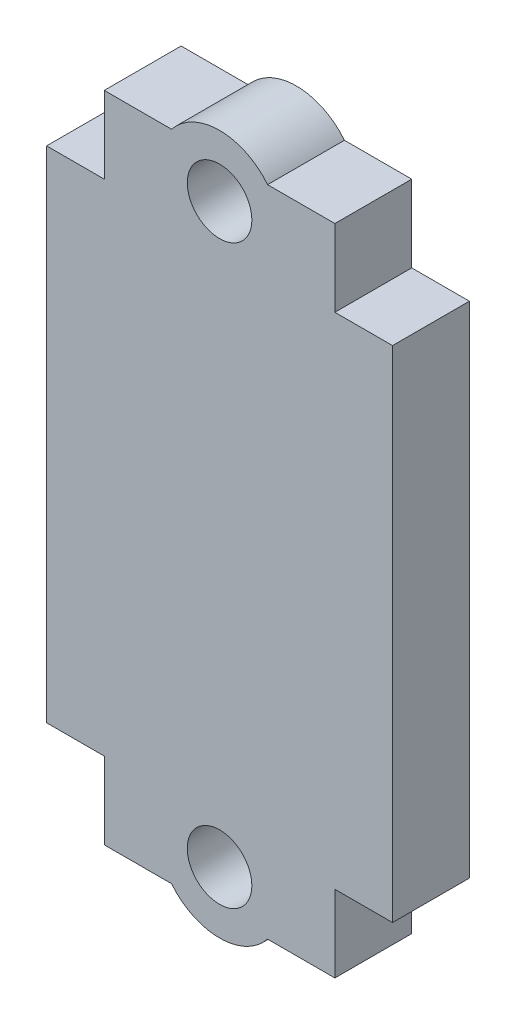
ISO-10303-21;
HEADER;
FILE_DESCRIPTION(('STEP AP214'),'2;1');
FILE_NAME('part.step','',(''),(''),'','','');
FILE_SCHEMA(('AUTOMOTIVE_DESIGN { 1 0 10303 214 1 1 1 1 }'));
ENDSEC;
DATA;
#1=APPLICATION_CONTEXT('core data for automotive mechanical design processes');
#2=APPLICATION_PROTOCOL_DEFINITION('international standard','automotive_design',2000,#1);
#3=PRODUCT_CONTEXT('',#1,'mechanical');
#4=PRODUCT('Part','Part','',(#3));
#5=PRODUCT_RELATED_PRODUCT_CATEGORY('part','',(#4));
#6=PRODUCT_DEFINITION_FORMATION('','',#4);
#7=PRODUCT_DEFINITION_CONTEXT('part definition',#1,'design');
#8=PRODUCT_DEFINITION('design','',#6,#7);
#9=PRODUCT_DEFINITION_SHAPE('','',#8);
#10=(LENGTH_UNIT() NAMED_UNIT(*) SI_UNIT(.MILLI.,.METRE.));
#11=(NAMED_UNIT(*) PLANE_ANGLE_UNIT() SI_UNIT($,.RADIAN.));
#12=(NAMED_UNIT(*) SI_UNIT($,.STERADIAN.) SOLID_ANGLE_UNIT());
#13=UNCERTAINTY_MEASURE_WITH_UNIT(LENGTH_MEASURE(1.E-05),#10,'distance_accuracy_value','');
#14=(GEOMETRIC_REPRESENTATION_CONTEXT(3) GLOBAL_UNCERTAINTY_ASSIGNED_CONTEXT((#13)) GLOBAL_UNIT_ASSIGNED_CONTEXT((#10,
#11,#12)) REPRESENTATION_CONTEXT('',''));
#15=CARTESIAN_POINT('',(0.,0.,0.));
#16=DIRECTION('',(0.,0.,1.));
#17=DIRECTION('',(1.,0.,0.));
#18=AXIS2_PLACEMENT_3D('',#15,#16,#17);
#19=CARTESIAN_POINT('',(-11.25,-2.5,5.));
#20=DIRECTION('',(0.,0.,-1.));
#21=DIRECTION('',(-1.,0.,0.));
#22=AXIS2_PLACEMENT_3D('',#19,#20,#21);
#23=CYLINDRICAL_SURFACE('',#22,2.1);
#24=CARTESIAN_POINT('',(-11.25,-2.5,5.));
#25=DIRECTION('',(0.,0.,1.));
#26=DIRECTION('',(1.,0.,0.));
#27=AXIS2_PLACEMENT_3D('',#24,#25,#26);
#28=CIRCLE('',#27,2.1);
#29=CARTESIAN_POINT('',(-9.15,-2.5,5.));
#30=VERTEX_POINT('',#29);
#31=EDGE_CURVE('E254',#30,#30,#28,.T.);
#32=ORIENTED_EDGE('',*,*,#31,.T.);
#33=EDGE_LOOP('',(#32));
#34=FACE_BOUND('',#33,.T.);
#35=CARTESIAN_POINT('',(-11.25,-2.5,0.));
#36=DIRECTION('',(0.,0.,1.));
#37=DIRECTION('',(1.,0.,0.));
#38=AXIS2_PLACEMENT_3D('',#35,#36,#37);
#39=CIRCLE('',#38,2.1);
#40=CARTESIAN_POINT('',(-9.15,-2.5,0.));
#41=VERTEX_POINT('',#40);
#42=EDGE_CURVE('E226',#41,#41,#39,.T.);
#43=ORIENTED_EDGE('',*,*,#42,.F.);
#44=EDGE_LOOP('',(#43));
#45=FACE_BOUND('',#44,.T.);
#46=ADVANCED_FACE('F85',(#34,#45),#23,.F.);
#47=CARTESIAN_POINT('',(0.,32.5,5.));
#48=DIRECTION('',(0.,-1.,0.));
#49=DIRECTION('',(0.,0.,-1.));
#50=AXIS2_PLACEMENT_3D('',#47,#48,#49);
#51=PLANE('',#50);
#52=DIRECTION('',(-1.,0.,0.));
#53=VECTOR('',#52,1.);
#54=CARTESIAN_POINT('',(0.,32.5,0.));
#55=LINE('',#54,#53);
#56=CARTESIAN_POINT('',(-18.75,32.5,0.));
#57=VERTEX_POINT('',#56);
#58=CARTESIAN_POINT('',(-22.5,32.5,0.));
#59=VERTEX_POINT('',#58);
#60=EDGE_CURVE('E263',#57,#59,#55,.T.);
#61=ORIENTED_EDGE('',*,*,#60,.T.);
#62=DIRECTION('',(0.,0.,-1.));
#63=VECTOR('',#62,1.);
#64=CARTESIAN_POINT('',(-22.5,32.5,5.));
#65=LINE('',#64,#63);
#66=CARTESIAN_POINT('',(-22.5,32.5,5.));
#67=VERTEX_POINT('',#66);
#68=EDGE_CURVE('E208',#67,#59,#65,.T.);
#69=ORIENTED_EDGE('',*,*,#68,.F.);
#70=DIRECTION('',(-1.,0.,0.));
#71=VECTOR('',#70,1.);
#72=CARTESIAN_POINT('',(0.,32.5,5.));
#73=LINE('',#72,#71);
#74=CARTESIAN_POINT('',(-18.75,32.5,5.));
#75=VERTEX_POINT('',#74);
#76=EDGE_CURVE('E211',#75,#67,#73,.T.);
#77=ORIENTED_EDGE('',*,*,#76,.F.);
#78=DIRECTION('',(0.,0.,-1.));
#79=VECTOR('',#78,1.);
#80=CARTESIAN_POINT('',(-18.75,32.5,5.));
#81=LINE('',#80,#79);
#82=EDGE_CURVE('E197',#75,#57,#81,.T.);
#83=ORIENTED_EDGE('',*,*,#82,.T.);
#84=EDGE_LOOP('',(#61,#69,#77,#83));
#85=FACE_BOUND('',#84,.T.);
#86=ADVANCED_FACE('F212',(#85),#51,.F.);
#87=CARTESIAN_POINT('',(-22.5,0.,5.));
#88=DIRECTION('',(-1.,0.,0.));
#89=DIRECTION('',(0.,0.,1.));
#90=AXIS2_PLACEMENT_3D('',#87,#88,#89);
#91=PLANE('',#90);
#92=DIRECTION('',(0.,1.,0.));
#93=VECTOR('',#92,1.);
#94=CARTESIAN_POINT('',(-22.5,0.,0.));
#95=LINE('',#94,#93);
#96=CARTESIAN_POINT('',(-22.5,0.,0.));
#97=VERTEX_POINT('',#96);
#98=EDGE_CURVE('E265',#97,#59,#95,.T.);
#99=ORIENTED_EDGE('',*,*,#98,.F.);
#100=DIRECTION('',(0.,0.,-1.));
#101=VECTOR('',#100,1.);
#102=CARTESIAN_POINT('',(-22.5,0.,5.));
#103=LINE('',#102,#101);
#104=CARTESIAN_POINT('',(-22.5,0.,5.));
#105=VERTEX_POINT('',#104);
#106=EDGE_CURVE('E323',#105,#97,#103,.T.);
#107=ORIENTED_EDGE('',*,*,#106,.F.);
#108=DIRECTION('',(0.,1.,0.));
#109=VECTOR('',#108,1.);
#110=CARTESIAN_POINT('',(-22.5,0.,5.));
#111=LINE('',#110,#109);
#112=EDGE_CURVE('E216',#105,#67,#111,.T.);
#113=ORIENTED_EDGE('',*,*,#112,.T.);
#114=ORIENTED_EDGE('',*,*,#68,.T.);
#115=EDGE_LOOP('',(#99,#107,#113,#114));
#116=FACE_BOUND('',#115,.T.);
#117=ADVANCED_FACE('F351',(#116),#91,.T.);
#118=CARTESIAN_POINT('',(0.,0.,5.));
#119=DIRECTION('',(0.,-1.,0.));
#120=DIRECTION('',(0.,0.,-1.));
#121=AXIS2_PLACEMENT_3D('',#118,#119,#120);
#122=PLANE('',#121);
#123=DIRECTION('',(-1.,0.,0.));
#124=VECTOR('',#123,1.);
#125=CARTESIAN_POINT('',(0.,0.,0.));
#126=LINE('',#125,#124);
#127=CARTESIAN_POINT('',(-18.75,0.,0.));
#128=VERTEX_POINT('',#127);
#129=EDGE_CURVE('E269',#128,#97,#126,.T.);
#130=ORIENTED_EDGE('',*,*,#129,.F.);
#131=DIRECTION('',(0.,0.,-1.));
#132=VECTOR('',#131,1.);
#133=CARTESIAN_POINT('',(-18.75,0.,5.));
#134=LINE('',#133,#132);
#135=CARTESIAN_POINT('',(-18.75,0.,5.));
#136=VERTEX_POINT('',#135);
#137=EDGE_CURVE('E321',#136,#128,#134,.T.);
#138=ORIENTED_EDGE('',*,*,#137,.F.);
#139=DIRECTION('',(-1.,0.,0.));
#140=VECTOR('',#139,1.);
#141=CARTESIAN_POINT('',(0.,0.,5.));
#142=LINE('',#141,#140);
#143=EDGE_CURVE('E230',#136,#105,#142,.T.);
#144=ORIENTED_EDGE('',*,*,#143,.T.);
#145=ORIENTED_EDGE('',*,*,#106,.T.);
#146=EDGE_LOOP('',(#130,#138,#144,#145));
#147=FACE_BOUND('',#146,.T.);
#148=ADVANCED_FACE('F374',(#147),#122,.T.);
#149=CARTESIAN_POINT('',(-18.75,0.,5.));
#150=DIRECTION('',(1.,0.,0.));
#151=DIRECTION('',(0.,0.,-1.));
#152=AXIS2_PLACEMENT_3D('',#149,#150,#151);
#153=PLANE('',#152);
#154=DIRECTION('',(0.,-1.,0.));
#155=VECTOR('',#154,1.);
#156=CARTESIAN_POINT('',(-18.75,0.,0.));
#157=LINE('',#156,#155);
#158=CARTESIAN_POINT('',(-18.75,-5.,0.));
#159=VERTEX_POINT('',#158);
#160=EDGE_CURVE('E272',#128,#159,#157,.T.);
#161=ORIENTED_EDGE('',*,*,#160,.T.);
#162=DIRECTION('',(0.,0.,-1.));
#163=VECTOR('',#162,1.);
#164=CARTESIAN_POINT('',(-18.75,-5.,5.));
#165=LINE('',#164,#163);
#166=CARTESIAN_POINT('',(-18.75,-5.,5.));
#167=VERTEX_POINT('',#166);
#168=EDGE_CURVE('E318',#167,#159,#165,.T.);
#169=ORIENTED_EDGE('',*,*,#168,.F.);
#170=DIRECTION('',(0.,-1.,0.));
#171=VECTOR('',#170,1.);
#172=CARTESIAN_POINT('',(-18.75,0.,5.));
#173=LINE('',#172,#171);
#174=EDGE_CURVE('E233',#136,#167,#173,.T.);
#175=ORIENTED_EDGE('',*,*,#174,.F.);
#176=ORIENTED_EDGE('',*,*,#137,.T.);
#177=EDGE_LOOP('',(#161,#169,#175,#176));
#178=FACE_BOUND('',#177,.T.);
#179=ADVANCED_FACE('F376',(#178),#153,.F.);
#180=CARTESIAN_POINT('',(0.,-5.,5.));
#181=DIRECTION('',(0.,1.,0.));
#182=DIRECTION('',(0.,0.,1.));
#183=AXIS2_PLACEMENT_3D('',#180,#181,#182);
#184=PLANE('',#183);
#185=DIRECTION('',(1.,0.,0.));
#186=VECTOR('',#185,1.);
#187=CARTESIAN_POINT('',(0.,-5.,0.));
#188=LINE('',#187,#186);
#189=CARTESIAN_POINT('',(-14.3724989991992,-5.,0.));
#190=VERTEX_POINT('',#189);
#191=EDGE_CURVE('E276',#159,#190,#188,.T.);
#192=ORIENTED_EDGE('',*,*,#191,.T.);
#193=DIRECTION('',(0.,0.,-1.));
#194=VECTOR('',#193,1.);
#195=CARTESIAN_POINT('',(-14.3724989991992,-5.,5.));
#196=LINE('',#195,#194);
#197=CARTESIAN_POINT('',(-14.3724989991992,-5.,5.));
#198=VERTEX_POINT('',#197);
#199=EDGE_CURVE('E316',#198,#190,#196,.T.);
#200=ORIENTED_EDGE('',*,*,#199,.F.);
#201=DIRECTION('',(1.,0.,0.));
#202=VECTOR('',#201,1.);
#203=CARTESIAN_POINT('',(0.,-5.,5.));
#204=LINE('',#203,#202);
#205=EDGE_CURVE('E237',#167,#198,#204,.T.);
#206=ORIENTED_EDGE('',*,*,#205,.F.);
#207=ORIENTED_EDGE('',*,*,#168,.T.);
#208=EDGE_LOOP('',(#192,#200,#206,#207));
#209=FACE_BOUND('',#208,.T.);
#210=ADVANCED_FACE('F379',(#209),#184,.F.);
#211=CARTESIAN_POINT('',(-11.25,-2.5,5.));
#212=DIRECTION('',(0.,0.,-1.));
#213=DIRECTION('',(-1.,0.,0.));
#214=AXIS2_PLACEMENT_3D('',#211,#212,#213);
#215=CYLINDRICAL_SURFACE('',#214,4.);
#216=CARTESIAN_POINT('',(-11.25,-2.5,0.));
#217=DIRECTION('',(0.,0.,1.));
#218=DIRECTION('',(1.,0.,0.));
#219=AXIS2_PLACEMENT_3D('',#216,#217,#218);
#220=CIRCLE('',#219,4.);
#221=CARTESIAN_POINT('',(-8.1275010008008,-5.,0.));
#222=VERTEX_POINT('',#221);
#223=EDGE_CURVE('E279',#222,#190,#220,.F.);
#224=ORIENTED_EDGE('',*,*,#223,.F.);
#225=DIRECTION('',(0.,0.,-1.));
#226=VECTOR('',#225,1.);
#227=CARTESIAN_POINT('',(-8.1275010008008,-5.,5.));
#228=LINE('',#227,#226);
#229=CARTESIAN_POINT('',(-8.1275010008008,-5.,5.));
#230=VERTEX_POINT('',#229);
#231=EDGE_CURVE('E314',#230,#222,#228,.T.);
#232=ORIENTED_EDGE('',*,*,#231,.F.);
#233=CARTESIAN_POINT('',(-11.25,-2.5,5.));
#234=DIRECTION('',(0.,0.,1.));
#235=DIRECTION('',(1.,0.,0.));
#236=AXIS2_PLACEMENT_3D('',#233,#234,#235);
#237=CIRCLE('',#236,4.);
#238=EDGE_CURVE('E239',#230,#198,#237,.F.);
#239=ORIENTED_EDGE('',*,*,#238,.T.);
#240=ORIENTED_EDGE('',*,*,#199,.T.);
#241=EDGE_LOOP('',(#224,#232,#239,#240));
#242=FACE_BOUND('',#241,.T.);
#243=ADVANCED_FACE('F381',(#242),#215,.T.);
#244=CARTESIAN_POINT('',(-3.75,-5.,0.));
#245=VERTEX_POINT('',#244);
#246=EDGE_CURVE('E280',#222,#245,#188,.T.);
#247=ORIENTED_EDGE('',*,*,#246,.T.);
#248=DIRECTION('',(0.,0.,-1.));
#249=VECTOR('',#248,1.);
#250=CARTESIAN_POINT('',(-3.75,-5.,5.));
#251=LINE('',#250,#249);
#252=CARTESIAN_POINT('',(-3.75,-5.,5.));
#253=VERTEX_POINT('',#252);
#254=EDGE_CURVE('E312',#253,#245,#251,.T.);
#255=ORIENTED_EDGE('',*,*,#254,.F.);
#256=EDGE_CURVE('E240',#230,#253,#204,.T.);
#257=ORIENTED_EDGE('',*,*,#256,.F.);
#258=ORIENTED_EDGE('',*,*,#231,.T.);
#259=EDGE_LOOP('',(#247,#255,#257,#258));
#260=FACE_BOUND('',#259,.T.);
#261=ADVANCED_FACE('F384',(#260),#184,.F.);
#262=CARTESIAN_POINT('',(-3.75,0.,5.));
#263=DIRECTION('',(1.,0.,0.));
#264=DIRECTION('',(0.,0.,-1.));
#265=AXIS2_PLACEMENT_3D('',#262,#263,#264);
#266=PLANE('',#265);
#267=DIRECTION('',(0.,-1.,0.));
#268=VECTOR('',#267,1.);
#269=CARTESIAN_POINT('',(-3.75,0.,0.));
#270=LINE('',#269,#268);
#271=CARTESIAN_POINT('',(-3.75,0.,0.));
#272=VERTEX_POINT('',#271);
#273=EDGE_CURVE('E283',#272,#245,#270,.T.);
#274=ORIENTED_EDGE('',*,*,#273,.F.);
#275=DIRECTION('',(0.,0.,-1.));
#276=VECTOR('',#275,1.);
#277=CARTESIAN_POINT('',(-3.75,0.,5.));
#278=LINE('',#277,#276);
#279=CARTESIAN_POINT('',(-3.75,0.,5.));
#280=VERTEX_POINT('',#279);
#281=EDGE_CURVE('E310',#280,#272,#278,.T.);
#282=ORIENTED_EDGE('',*,*,#281,.F.);
#283=DIRECTION('',(0.,-1.,0.));
#284=VECTOR('',#283,1.);
#285=CARTESIAN_POINT('',(-3.75,0.,5.));
#286=LINE('',#285,#284);
#287=EDGE_CURVE('E243',#280,#253,#286,.T.);
#288=ORIENTED_EDGE('',*,*,#287,.T.);
#289=ORIENTED_EDGE('',*,*,#254,.T.);
#290=EDGE_LOOP('',(#274,#282,#288,#289));
#291=FACE_BOUND('',#290,.T.);
#292=ADVANCED_FACE('F388',(#291),#266,.T.);
#293=CARTESIAN_POINT('',(0.,0.,0.));
#294=VERTEX_POINT('',#293);
#295=EDGE_CURVE('E273',#294,#272,#126,.T.);
#296=ORIENTED_EDGE('',*,*,#295,.F.);
#297=DIRECTION('',(0.,0.,-1.));
#298=VECTOR('',#297,1.);
#299=CARTESIAN_POINT('',(0.,0.,5.));
#300=LINE('',#299,#298);
#301=CARTESIAN_POINT('',(0.,0.,5.));
#302=VERTEX_POINT('',#301);
#303=EDGE_CURVE('E308',#302,#294,#300,.T.);
#304=ORIENTED_EDGE('',*,*,#303,.F.);
#305=EDGE_CURVE('E234',#302,#280,#142,.T.);
#306=ORIENTED_EDGE('',*,*,#305,.T.);
#307=ORIENTED_EDGE('',*,*,#281,.T.);
#308=EDGE_LOOP('',(#296,#304,#306,#307));
#309=FACE_BOUND('',#308,.T.);
#310=ADVANCED_FACE('F392',(#309),#122,.T.);
#311=CARTESIAN_POINT('',(0.,0.,5.));
#312=DIRECTION('',(-1.,0.,0.));
#313=DIRECTION('',(0.,-1.,0.));
#314=AXIS2_PLACEMENT_3D('',#311,#312,#313);
#315=PLANE('',#314);
#316=DIRECTION('',(0.,1.,0.));
#317=VECTOR('',#316,1.);
#318=CARTESIAN_POINT('',(0.,0.,0.));
#319=LINE('',#318,#317);
#320=CARTESIAN_POINT('',(0.,32.5,0.));
#321=VERTEX_POINT('',#320);
#322=EDGE_CURVE('E286',#294,#321,#319,.T.);
#323=ORIENTED_EDGE('',*,*,#322,.T.);
#324=DIRECTION('',(0.,0.,-1.));
#325=VECTOR('',#324,1.);
#326=CARTESIAN_POINT('',(0.,32.5,5.));
#327=LINE('',#326,#325);
#328=CARTESIAN_POINT('',(0.,32.5,5.));
#329=VERTEX_POINT('',#328);
#330=EDGE_CURVE('E305',#329,#321,#327,.T.);
#331=ORIENTED_EDGE('',*,*,#330,.F.);
#332=DIRECTION('',(0.,1.,0.));
#333=VECTOR('',#332,1.);
#334=CARTESIAN_POINT('',(0.,0.,5.));
#335=LINE('',#334,#333);
#336=EDGE_CURVE('E246',#302,#329,#335,.T.);
#337=ORIENTED_EDGE('',*,*,#336,.F.);
#338=ORIENTED_EDGE('',*,*,#303,.T.);
#339=EDGE_LOOP('',(#323,#331,#337,#338));
#340=FACE_BOUND('',#339,.T.);
#341=ADVANCED_FACE('F396',(#340),#315,.F.);
#342=CARTESIAN_POINT('',(-3.75,32.5,0.));
#343=VERTEX_POINT('',#342);
#344=EDGE_CURVE('E266',#321,#343,#55,.T.);
#345=ORIENTED_EDGE('',*,*,#344,.T.);
#346=DIRECTION('',(0.,0.,-1.));
#347=VECTOR('',#346,1.);
#348=CARTESIAN_POINT('',(-3.75,32.5,5.));
#349=LINE('',#348,#347);
#350=CARTESIAN_POINT('',(-3.75,32.5,5.));
#351=VERTEX_POINT('',#350);
#352=EDGE_CURVE('E302',#351,#343,#349,.T.);
#353=ORIENTED_EDGE('',*,*,#352,.F.);
#354=EDGE_CURVE('E218',#329,#351,#73,.T.);
#355=ORIENTED_EDGE('',*,*,#354,.F.);
#356=ORIENTED_EDGE('',*,*,#330,.T.);
#357=EDGE_LOOP('',(#345,#353,#355,#356));
#358=FACE_BOUND('',#357,.T.);
#359=ADVANCED_FACE('F353',(#358),#51,.F.);
#360=CARTESIAN_POINT('',(-3.75,0.,5.));
#361=DIRECTION('',(-1.,0.,0.));
#362=DIRECTION('',(0.,0.,1.));
#363=AXIS2_PLACEMENT_3D('',#360,#361,#362);
#364=PLANE('',#363);
#365=DIRECTION('',(0.,1.,0.));
#366=VECTOR('',#365,1.);
#367=CARTESIAN_POINT('',(-3.75,0.,0.));
#368=LINE('',#367,#366);
#369=CARTESIAN_POINT('',(-3.75,37.5,0.));
#370=VERTEX_POINT('',#369);
#371=EDGE_CURVE('E289',#343,#370,#368,.T.);
#372=ORIENTED_EDGE('',*,*,#371,.T.);
#373=DIRECTION('',(0.,0.,-1.));
#374=VECTOR('',#373,1.);
#375=CARTESIAN_POINT('',(-3.75,37.5,5.));
#376=LINE('',#375,#374);
#377=CARTESIAN_POINT('',(-3.75,37.5,5.));
#378=VERTEX_POINT('',#377);
#379=EDGE_CURVE('E299',#378,#370,#376,.T.);
#380=ORIENTED_EDGE('',*,*,#379,.F.);
#381=DIRECTION('',(0.,1.,0.));
#382=VECTOR('',#381,1.);
#383=CARTESIAN_POINT('',(-3.75,0.,5.));
#384=LINE('',#383,#382);
#385=EDGE_CURVE('E249',#351,#378,#384,.T.);
#386=ORIENTED_EDGE('',*,*,#385,.F.);
#387=ORIENTED_EDGE('',*,*,#352,.T.);
#388=EDGE_LOOP('',(#372,#380,#386,#387));
#389=FACE_BOUND('',#388,.T.);
#390=ADVANCED_FACE('F343',(#389),#364,.F.);
#391=CARTESIAN_POINT('',(0.,37.5,5.));
#392=DIRECTION('',(0.,1.,0.));
#393=DIRECTION('',(0.,0.,1.));
#394=AXIS2_PLACEMENT_3D('',#391,#392,#393);
#395=PLANE('',#394);
#396=DIRECTION('',(1.,0.,0.));
#397=VECTOR('',#396,1.);
#398=CARTESIAN_POINT('',(0.,37.5,0.));
#399=LINE('',#398,#397);
#400=CARTESIAN_POINT('',(-8.1275010008008,37.5,0.));
#401=VERTEX_POINT('',#400);
#402=EDGE_CURVE('E292',#401,#370,#399,.T.);
#403=ORIENTED_EDGE('',*,*,#402,.F.);
#404=DIRECTION('',(0.,0.,-1.));
#405=VECTOR('',#404,1.);
#406=CARTESIAN_POINT('',(-8.1275010008008,37.5,5.));
#407=LINE('',#406,#405);
#408=CARTESIAN_POINT('',(-8.1275010008008,37.5,5.));
#409=VERTEX_POINT('',#408);
#410=EDGE_CURVE('E12',#401,#409,#407,.F.);
#411=ORIENTED_EDGE('',*,*,#410,.T.);
#412=DIRECTION('',(1.,0.,0.));
#413=VECTOR('',#412,1.);
#414=CARTESIAN_POINT('',(0.,37.5,5.));
#415=LINE('',#414,#413);
#416=EDGE_CURVE('E252',#409,#378,#415,.T.);
#417=ORIENTED_EDGE('',*,*,#416,.T.);
#418=ORIENTED_EDGE('',*,*,#379,.T.);
#419=EDGE_LOOP('',(#403,#411,#417,#418));
#420=FACE_BOUND('',#419,.T.);
#421=ADVANCED_FACE('F335',(#420),#395,.T.);
#422=CARTESIAN_POINT('',(-18.75,37.5,5.));
#423=VERTEX_POINT('',#422);
#424=CARTESIAN_POINT('',(-14.3724989991992,37.5,5.));
#425=VERTEX_POINT('',#424);
#426=EDGE_CURVE('E222',#423,#425,#415,.T.);
#427=ORIENTED_EDGE('',*,*,#426,.T.);
#428=DIRECTION('',(0.,0.,-1.));
#429=VECTOR('',#428,1.);
#430=CARTESIAN_POINT('',(-14.3724989991992,37.5,5.));
#431=LINE('',#430,#429);
#432=CARTESIAN_POINT('',(-14.3724989991992,37.5,0.));
#433=VERTEX_POINT('',#432);
#434=EDGE_CURVE('E94',#425,#433,#431,.T.);
#435=ORIENTED_EDGE('',*,*,#434,.T.);
#436=CARTESIAN_POINT('',(-18.75,37.5,0.));
#437=VERTEX_POINT('',#436);
#438=EDGE_CURVE('E293',#437,#433,#399,.T.);
#439=ORIENTED_EDGE('',*,*,#438,.F.);
#440=DIRECTION('',(0.,0.,-1.));
#441=VECTOR('',#440,1.);
#442=CARTESIAN_POINT('',(-18.75,37.5,5.));
#443=LINE('',#442,#441);
#444=EDGE_CURVE('E257',#423,#437,#443,.T.);
#445=ORIENTED_EDGE('',*,*,#444,.F.);
#446=EDGE_LOOP('',(#427,#435,#439,#445));
#447=FACE_BOUND('',#446,.T.);
#448=ADVANCED_FACE('F333',(#447),#395,.T.);
#449=CARTESIAN_POINT('',(-18.75,0.,5.));
#450=DIRECTION('',(-1.,0.,0.));
#451=DIRECTION('',(0.,0.,1.));
#452=AXIS2_PLACEMENT_3D('',#449,#450,#451);
#453=PLANE('',#452);
#454=DIRECTION('',(0.,1.,0.));
#455=VECTOR('',#454,1.);
#456=CARTESIAN_POINT('',(-18.75,0.,0.));
#457=LINE('',#456,#455);
#458=EDGE_CURVE('E204',#57,#437,#457,.T.);
#459=ORIENTED_EDGE('',*,*,#458,.F.);
#460=ORIENTED_EDGE('',*,*,#82,.F.);
#461=DIRECTION('',(0.,1.,0.));
#462=VECTOR('',#461,1.);
#463=CARTESIAN_POINT('',(-18.75,0.,5.));
#464=LINE('',#463,#462);
#465=EDGE_CURVE('E201',#75,#423,#464,.T.);
#466=ORIENTED_EDGE('',*,*,#465,.T.);
#467=ORIENTED_EDGE('',*,*,#444,.T.);
#468=EDGE_LOOP('',(#459,#460,#466,#467));
#469=FACE_BOUND('',#468,.T.);
#470=ADVANCED_FACE('F199',(#469),#453,.T.);
#471=CARTESIAN_POINT('',(-11.25,35.,5.));
#472=DIRECTION('',(0.,0.,-1.));
#473=DIRECTION('',(-1.,0.,0.));
#474=AXIS2_PLACEMENT_3D('',#471,#472,#473);
#475=CYLINDRICAL_SURFACE('',#474,2.1);
#476=CARTESIAN_POINT('',(-11.25,35.,5.));
#477=DIRECTION('',(0.,0.,1.));
#478=DIRECTION('',(1.,0.,0.));
#479=AXIS2_PLACEMENT_3D('',#476,#477,#478);
#480=CIRCLE('',#479,2.1);
#481=CARTESIAN_POINT('',(-9.15,35.,5.));
#482=VERTEX_POINT('',#481);
#483=EDGE_CURVE('E223',#482,#482,#480,.T.);
#484=ORIENTED_EDGE('',*,*,#483,.T.);
#485=EDGE_LOOP('',(#484));
#486=FACE_BOUND('',#485,.T.);
#487=CARTESIAN_POINT('',(-11.25,35.,0.));
#488=DIRECTION('',(0.,0.,1.));
#489=DIRECTION('',(1.,0.,0.));
#490=AXIS2_PLACEMENT_3D('',#487,#488,#489);
#491=CIRCLE('',#490,2.1);
#492=CARTESIAN_POINT('',(-9.15,35.,0.));
#493=VERTEX_POINT('',#492);
#494=EDGE_CURVE('E258',#493,#493,#491,.T.);
#495=ORIENTED_EDGE('',*,*,#494,.F.);
#496=EDGE_LOOP('',(#495));
#497=FACE_BOUND('',#496,.T.);
#498=ADVANCED_FACE('F341',(#486,#497),#475,.F.);
#499=CARTESIAN_POINT('',(0.,0.,0.));
#500=DIRECTION('',(0.,0.,1.));
#501=DIRECTION('',(1.,0.,0.));
#502=AXIS2_PLACEMENT_3D('',#499,#500,#501);
#503=PLANE('',#502);
#504=ORIENTED_EDGE('',*,*,#494,.T.);
#505=EDGE_LOOP('',(#504));
#506=FACE_BOUND('',#505,.T.);
#507=ORIENTED_EDGE('',*,*,#458,.T.);
#508=ORIENTED_EDGE('',*,*,#438,.T.);
#509=CARTESIAN_POINT('',(-11.25,35.,0.));
#510=DIRECTION('',(0.,0.,1.));
#511=DIRECTION('',(1.,0.,0.));
#512=AXIS2_PLACEMENT_3D('',#509,#510,#511);
#513=CIRCLE('',#512,4.);
#514=EDGE_CURVE('E89',#401,#433,#513,.T.);
#515=ORIENTED_EDGE('',*,*,#514,.F.);
#516=ORIENTED_EDGE('',*,*,#402,.T.);
#517=ORIENTED_EDGE('',*,*,#371,.F.);
#518=ORIENTED_EDGE('',*,*,#344,.F.);
#519=ORIENTED_EDGE('',*,*,#322,.F.);
#520=ORIENTED_EDGE('',*,*,#295,.T.);
#521=ORIENTED_EDGE('',*,*,#273,.T.);
#522=ORIENTED_EDGE('',*,*,#246,.F.);
#523=ORIENTED_EDGE('',*,*,#223,.T.);
#524=ORIENTED_EDGE('',*,*,#191,.F.);
#525=ORIENTED_EDGE('',*,*,#160,.F.);
#526=ORIENTED_EDGE('',*,*,#129,.T.);
#527=ORIENTED_EDGE('',*,*,#98,.T.);
#528=ORIENTED_EDGE('',*,*,#60,.F.);
#529=EDGE_LOOP('',(#507,#508,#515,#516,#517,#518,#519,#520,#521,#522,#523,#524,#525,#526,#527,#528));
#530=FACE_BOUND('',#529,.T.);
#531=ORIENTED_EDGE('',*,*,#42,.T.);
#532=EDGE_LOOP('',(#531));
#533=FACE_BOUND('',#532,.T.);
#534=ADVANCED_FACE('F330',(#506,#530,#533),#503,.F.);
#535=CARTESIAN_POINT('',(0.,0.,5.));
#536=DIRECTION('',(0.,0.,1.));
#537=DIRECTION('',(1.,0.,0.));
#538=AXIS2_PLACEMENT_3D('',#535,#536,#537);
#539=PLANE('',#538);
#540=ORIENTED_EDGE('',*,*,#483,.F.);
#541=EDGE_LOOP('',(#540));
#542=FACE_BOUND('',#541,.T.);
#543=ORIENTED_EDGE('',*,*,#465,.F.);
#544=ORIENTED_EDGE('',*,*,#76,.T.);
#545=ORIENTED_EDGE('',*,*,#112,.F.);
#546=ORIENTED_EDGE('',*,*,#143,.F.);
#547=ORIENTED_EDGE('',*,*,#174,.T.);
#548=ORIENTED_EDGE('',*,*,#205,.T.);
#549=ORIENTED_EDGE('',*,*,#238,.F.);
#550=ORIENTED_EDGE('',*,*,#256,.T.);
#551=ORIENTED_EDGE('',*,*,#287,.F.);
#552=ORIENTED_EDGE('',*,*,#305,.F.);
#553=ORIENTED_EDGE('',*,*,#336,.T.);
#554=ORIENTED_EDGE('',*,*,#354,.T.);
#555=ORIENTED_EDGE('',*,*,#385,.T.);
#556=ORIENTED_EDGE('',*,*,#416,.F.);
#557=CARTESIAN_POINT('',(-11.25,35.,5.));
#558=DIRECTION('',(0.,0.,1.));
#559=DIRECTION('',(1.,0.,0.));
#560=AXIS2_PLACEMENT_3D('',#557,#558,#559);
#561=CIRCLE('',#560,4.);
#562=EDGE_CURVE('E261',#409,#425,#561,.T.);
#563=ORIENTED_EDGE('',*,*,#562,.T.);
#564=ORIENTED_EDGE('',*,*,#426,.F.);
#565=EDGE_LOOP('',(#543,#544,#545,#546,#547,#548,#549,#550,#551,#552,#553,#554,#555,#556,#563,#564));
#566=FACE_BOUND('',#565,.T.);
#567=ORIENTED_EDGE('',*,*,#31,.F.);
#568=EDGE_LOOP('',(#567));
#569=FACE_BOUND('',#568,.T.);
#570=ADVANCED_FACE('F219',(#542,#566,#569),#539,.T.);
#571=CARTESIAN_POINT('',(-11.25,35.,5.));
#572=DIRECTION('',(0.,0.,-1.));
#573=DIRECTION('',(-1.,0.,0.));
#574=AXIS2_PLACEMENT_3D('',#571,#572,#573);
#575=CYLINDRICAL_SURFACE('',#574,4.);
#576=ORIENTED_EDGE('',*,*,#514,.T.);
#577=ORIENTED_EDGE('',*,*,#434,.F.);
#578=ORIENTED_EDGE('',*,*,#562,.F.);
#579=ORIENTED_EDGE('',*,*,#410,.F.);
#580=EDGE_LOOP('',(#576,#577,#578,#579));
#581=FACE_BOUND('',#580,.T.);
#582=ADVANCED_FACE('F87',(#581),#575,.T.);
#583=CLOSED_SHELL('',(#46,#86,#117,#148,#179,#210,#243,#261,#292,#310,#341,#359,#390,#421,#448,
#470,#498,#534,#570,#582));
#584=MANIFOLD_SOLID_BREP('B2',#583);
#585=ADVANCED_BREP_SHAPE_REPRESENTATION('',(#18,#584),#14);
#586=SHAPE_DEFINITION_REPRESENTATION(#9,#585);
ENDSEC;
END-ISO-10303-21;
